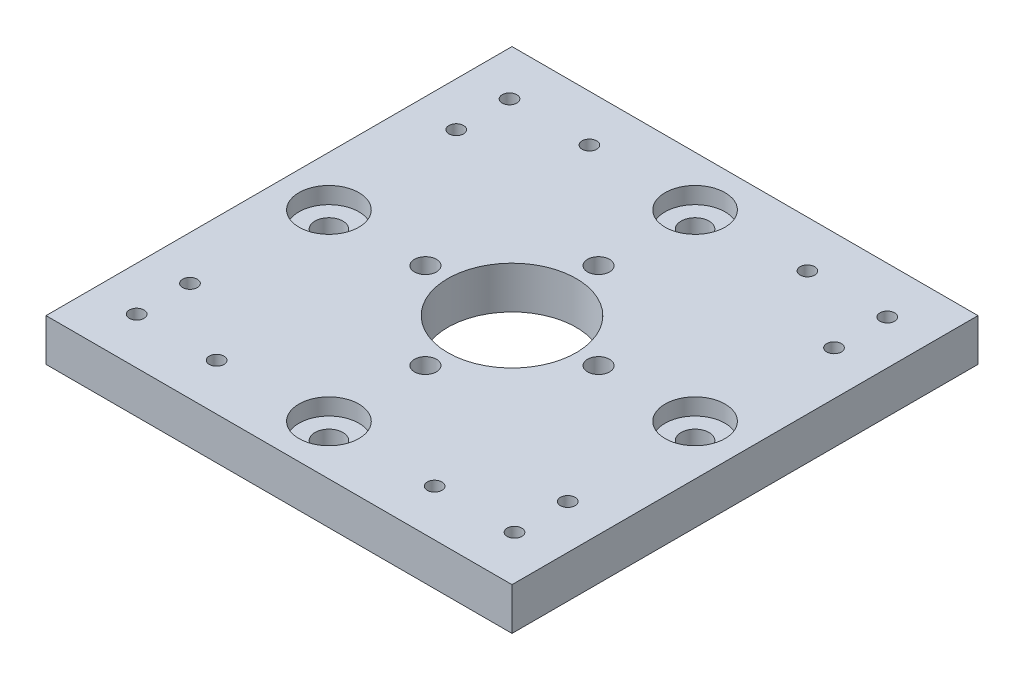
ISO-10303-21;
HEADER;
FILE_DESCRIPTION(('STEP AP214'),'2;1');
FILE_NAME('part.step','',(''),(''),'','','');
FILE_SCHEMA(('AUTOMOTIVE_DESIGN { 1 0 10303 214 1 1 1 1 }'));
ENDSEC;
DATA;
#1=APPLICATION_CONTEXT('core data for automotive mechanical design processes');
#2=APPLICATION_PROTOCOL_DEFINITION('international standard','automotive_design',2000,#1);
#3=PRODUCT_CONTEXT('',#1,'mechanical');
#4=PRODUCT('Part','Part','',(#3));
#5=PRODUCT_RELATED_PRODUCT_CATEGORY('part','',(#4));
#6=PRODUCT_DEFINITION_FORMATION('','',#4);
#7=PRODUCT_DEFINITION_CONTEXT('part definition',#1,'design');
#8=PRODUCT_DEFINITION('design','',#6,#7);
#9=PRODUCT_DEFINITION_SHAPE('','',#8);
#10=(LENGTH_UNIT() NAMED_UNIT(*) SI_UNIT(.MILLI.,.METRE.));
#11=(NAMED_UNIT(*) PLANE_ANGLE_UNIT() SI_UNIT($,.RADIAN.));
#12=(NAMED_UNIT(*) SI_UNIT($,.STERADIAN.) SOLID_ANGLE_UNIT());
#13=UNCERTAINTY_MEASURE_WITH_UNIT(LENGTH_MEASURE(1.E-05),#10,'distance_accuracy_value','');
#14=(GEOMETRIC_REPRESENTATION_CONTEXT(3) GLOBAL_UNCERTAINTY_ASSIGNED_CONTEXT((#13)) GLOBAL_UNIT_ASSIGNED_CONTEXT((#10,
#11,#12)) REPRESENTATION_CONTEXT('',''));
#15=CARTESIAN_POINT('',(0.,0.,0.));
#16=DIRECTION('',(0.,0.,1.));
#17=DIRECTION('',(1.,0.,0.));
#18=AXIS2_PLACEMENT_3D('',#15,#16,#17);
#19=CARTESIAN_POINT('',(1.55309068257925E-12,-0.00100000000000013,27.5));
#20=DIRECTION('',(0.,1.,0.));
#21=DIRECTION('',(0.,0.,1.));
#22=AXIS2_PLACEMENT_3D('',#19,#20,#21);
#23=CYLINDRICAL_SURFACE('',#22,2.1);
#24=CARTESIAN_POINT('',(1.55309068257925E-12,0.,27.5));
#25=DIRECTION('',(0.,1.,0.));
#26=DIRECTION('',(0.,0.,1.));
#27=AXIS2_PLACEMENT_3D('',#24,#25,#26);
#28=CIRCLE('',#27,2.1);
#29=CARTESIAN_POINT('',(1.55309068257925E-12,0.,29.6));
#30=VERTEX_POINT('',#29);
#31=EDGE_CURVE('E141',#30,#30,#28,.F.);
#32=ORIENTED_EDGE('',*,*,#31,.T.);
#33=EDGE_LOOP('',(#32));
#34=FACE_BOUND('',#33,.T.);
#35=CARTESIAN_POINT('',(1.55309068257925E-12,3.85,27.5));
#36=DIRECTION('',(0.,1.,0.));
#37=DIRECTION('',(0.,0.,1.));
#38=AXIS2_PLACEMENT_3D('',#35,#36,#37);
#39=CIRCLE('',#38,2.1);
#40=CARTESIAN_POINT('',(1.55309068257925E-12,3.85,29.6));
#41=VERTEX_POINT('',#40);
#42=EDGE_CURVE('E43',#41,#41,#39,.F.);
#43=ORIENTED_EDGE('',*,*,#42,.F.);
#44=EDGE_LOOP('',(#43));
#45=FACE_BOUND('',#44,.T.);
#46=ADVANCED_FACE('F39',(#34,#45),#23,.F.);
#47=CARTESIAN_POINT('',(27.5000000000008,-0.00100000000000013,-7.76545341289627E-13));
#48=DIRECTION('',(0.,1.,0.));
#49=DIRECTION('',(0.,0.,1.));
#50=AXIS2_PLACEMENT_3D('',#47,#48,#49);
#51=CYLINDRICAL_SURFACE('',#50,2.1);
#52=CARTESIAN_POINT('',(27.5000000000008,0.,-7.76545341289627E-13));
#53=DIRECTION('',(0.,1.,0.));
#54=DIRECTION('',(0.,0.,1.));
#55=AXIS2_PLACEMENT_3D('',#52,#53,#54);
#56=CIRCLE('',#55,2.1);
#57=CARTESIAN_POINT('',(27.5000000000008,0.,2.09999999999922));
#58=VERTEX_POINT('',#57);
#59=EDGE_CURVE('E145',#58,#58,#56,.F.);
#60=ORIENTED_EDGE('',*,*,#59,.T.);
#61=EDGE_LOOP('',(#60));
#62=FACE_BOUND('',#61,.T.);
#63=CARTESIAN_POINT('',(27.5000000000008,3.85,-7.76545341289627E-13));
#64=DIRECTION('',(0.,1.,0.));
#65=DIRECTION('',(0.,0.,1.));
#66=AXIS2_PLACEMENT_3D('',#63,#64,#65);
#67=CIRCLE('',#66,2.1);
#68=CARTESIAN_POINT('',(27.5000000000008,3.85,2.09999999999922));
#69=VERTEX_POINT('',#68);
#70=EDGE_CURVE('E136',#69,#69,#67,.F.);
#71=ORIENTED_EDGE('',*,*,#70,.F.);
#72=EDGE_LOOP('',(#71));
#73=FACE_BOUND('',#72,.T.);
#74=ADVANCED_FACE('F264',(#62,#73),#51,.F.);
#75=CARTESIAN_POINT('',(0.,-0.00100000000000013,-27.5));
#76=DIRECTION('',(0.,1.,0.));
#77=DIRECTION('',(0.,0.,1.));
#78=AXIS2_PLACEMENT_3D('',#75,#76,#77);
#79=CYLINDRICAL_SURFACE('',#78,2.1);
#80=CARTESIAN_POINT('',(0.,0.,-27.5));
#81=DIRECTION('',(0.,1.,0.));
#82=DIRECTION('',(0.,0.,1.));
#83=AXIS2_PLACEMENT_3D('',#80,#81,#82);
#84=CIRCLE('',#83,2.1);
#85=CARTESIAN_POINT('',(0.,0.,-25.4));
#86=VERTEX_POINT('',#85);
#87=EDGE_CURVE('E150',#86,#86,#84,.F.);
#88=ORIENTED_EDGE('',*,*,#87,.T.);
#89=EDGE_LOOP('',(#88));
#90=FACE_BOUND('',#89,.T.);
#91=CARTESIAN_POINT('',(0.,3.85,-27.5));
#92=DIRECTION('',(0.,1.,0.));
#93=DIRECTION('',(0.,0.,1.));
#94=AXIS2_PLACEMENT_3D('',#91,#92,#93);
#95=CIRCLE('',#94,2.1);
#96=CARTESIAN_POINT('',(0.,3.85,-25.4));
#97=VERTEX_POINT('',#96);
#98=EDGE_CURVE('E133',#97,#97,#95,.F.);
#99=ORIENTED_EDGE('',*,*,#98,.F.);
#100=EDGE_LOOP('',(#99));
#101=FACE_BOUND('',#100,.T.);
#102=ADVANCED_FACE('F269',(#90,#101),#79,.F.);
#103=CARTESIAN_POINT('',(-27.4999999999992,-0.00100000000000013,7.79913119987283E-13));
#104=DIRECTION('',(0.,1.,0.));
#105=DIRECTION('',(0.,0.,1.));
#106=AXIS2_PLACEMENT_3D('',#103,#104,#105);
#107=CYLINDRICAL_SURFACE('',#106,2.1);
#108=CARTESIAN_POINT('',(-27.4999999999992,0.,7.79913119987283E-13));
#109=DIRECTION('',(0.,1.,0.));
#110=DIRECTION('',(0.,0.,1.));
#111=AXIS2_PLACEMENT_3D('',#108,#109,#110);
#112=CIRCLE('',#111,2.1);
#113=CARTESIAN_POINT('',(-27.4999999999992,0.,2.10000000000078));
#114=VERTEX_POINT('',#113);
#115=EDGE_CURVE('E158',#114,#114,#112,.F.);
#116=ORIENTED_EDGE('',*,*,#115,.T.);
#117=EDGE_LOOP('',(#116));
#118=FACE_BOUND('',#117,.T.);
#119=CARTESIAN_POINT('',(-27.4999999999992,3.85,7.79913119987283E-13));
#120=DIRECTION('',(0.,1.,0.));
#121=DIRECTION('',(0.,0.,1.));
#122=AXIS2_PLACEMENT_3D('',#119,#120,#121);
#123=CIRCLE('',#122,2.1);
#124=CARTESIAN_POINT('',(-27.4999999999992,3.85,2.10000000000078));
#125=VERTEX_POINT('',#124);
#126=EDGE_CURVE('E130',#125,#125,#123,.F.);
#127=ORIENTED_EDGE('',*,*,#126,.F.);
#128=EDGE_LOOP('',(#127));
#129=FACE_BOUND('',#128,.T.);
#130=ADVANCED_FACE('F342',(#118,#129),#107,.F.);
#131=CARTESIAN_POINT('',(0.,6.35,35.));
#132=DIRECTION('',(0.,0.,-1.));
#133=DIRECTION('',(-1.,0.,0.));
#134=AXIS2_PLACEMENT_3D('',#131,#132,#133);
#135=PLANE('',#134);
#136=DIRECTION('',(1.,0.,0.));
#137=VECTOR('',#136,1.);
#138=CARTESIAN_POINT('',(0.,0.,35.));
#139=LINE('',#138,#137);
#140=CARTESIAN_POINT('',(-35.,0.,35.));
#141=VERTEX_POINT('',#140);
#142=CARTESIAN_POINT('',(35.,0.,35.));
#143=VERTEX_POINT('',#142);
#144=EDGE_CURVE('E119',#141,#143,#139,.T.);
#145=ORIENTED_EDGE('',*,*,#144,.T.);
#146=DIRECTION('',(0.,-1.,0.));
#147=VECTOR('',#146,1.);
#148=CARTESIAN_POINT('',(35.,6.35,35.));
#149=LINE('',#148,#147);
#150=CARTESIAN_POINT('',(35.,6.35,35.));
#151=VERTEX_POINT('',#150);
#152=EDGE_CURVE('E11',#151,#143,#149,.T.);
#153=ORIENTED_EDGE('',*,*,#152,.F.);
#154=DIRECTION('',(1.,0.,0.));
#155=VECTOR('',#154,1.);
#156=CARTESIAN_POINT('',(0.,6.35,35.));
#157=LINE('',#156,#155);
#158=CARTESIAN_POINT('',(-35.,6.35,35.));
#159=VERTEX_POINT('',#158);
#160=EDGE_CURVE('E91',#159,#151,#157,.T.);
#161=ORIENTED_EDGE('',*,*,#160,.F.);
#162=DIRECTION('',(0.,-1.,0.));
#163=VECTOR('',#162,1.);
#164=CARTESIAN_POINT('',(-35.,6.35,35.));
#165=LINE('',#164,#163);
#166=EDGE_CURVE('E58',#159,#141,#165,.T.);
#167=ORIENTED_EDGE('',*,*,#166,.T.);
#168=EDGE_LOOP('',(#145,#153,#161,#167));
#169=FACE_BOUND('',#168,.T.);
#170=ADVANCED_FACE('F340',(#169),#135,.F.);
#171=CARTESIAN_POINT('',(35.,6.35,0.));
#172=DIRECTION('',(-1.,0.,0.));
#173=DIRECTION('',(0.,0.,1.));
#174=AXIS2_PLACEMENT_3D('',#171,#172,#173);
#175=PLANE('',#174);
#176=DIRECTION('',(0.,0.,-1.));
#177=VECTOR('',#176,1.);
#178=CARTESIAN_POINT('',(35.,0.,0.));
#179=LINE('',#178,#177);
#180=CARTESIAN_POINT('',(35.,0.,-35.));
#181=VERTEX_POINT('',#180);
#182=EDGE_CURVE('E96',#143,#181,#179,.T.);
#183=ORIENTED_EDGE('',*,*,#182,.T.);
#184=DIRECTION('',(0.,-1.,0.));
#185=VECTOR('',#184,1.);
#186=CARTESIAN_POINT('',(35.,6.35,-35.));
#187=LINE('',#186,#185);
#188=CARTESIAN_POINT('',(35.,6.35,-35.));
#189=VERTEX_POINT('',#188);
#190=EDGE_CURVE('E49',#189,#181,#187,.T.);
#191=ORIENTED_EDGE('',*,*,#190,.F.);
#192=DIRECTION('',(0.,0.,-1.));
#193=VECTOR('',#192,1.);
#194=CARTESIAN_POINT('',(35.,6.35,0.));
#195=LINE('',#194,#193);
#196=EDGE_CURVE('E83',#151,#189,#195,.T.);
#197=ORIENTED_EDGE('',*,*,#196,.F.);
#198=ORIENTED_EDGE('',*,*,#152,.T.);
#199=EDGE_LOOP('',(#183,#191,#197,#198));
#200=FACE_BOUND('',#199,.T.);
#201=ADVANCED_FACE('F95',(#200),#175,.F.);
#202=CARTESIAN_POINT('',(0.,6.35,-35.));
#203=DIRECTION('',(0.,0.,-1.));
#204=DIRECTION('',(-1.,0.,0.));
#205=AXIS2_PLACEMENT_3D('',#202,#203,#204);
#206=PLANE('',#205);
#207=DIRECTION('',(1.,0.,0.));
#208=VECTOR('',#207,1.);
#209=CARTESIAN_POINT('',(0.,0.,-35.));
#210=LINE('',#209,#208);
#211=CARTESIAN_POINT('',(-35.,0.,-35.));
#212=VERTEX_POINT('',#211);
#213=EDGE_CURVE('E122',#212,#181,#210,.T.);
#214=ORIENTED_EDGE('',*,*,#213,.F.);
#215=DIRECTION('',(0.,-1.,0.));
#216=VECTOR('',#215,1.);
#217=CARTESIAN_POINT('',(-35.,6.35,-35.));
#218=LINE('',#217,#216);
#219=CARTESIAN_POINT('',(-35.,6.35,-35.));
#220=VERTEX_POINT('',#219);
#221=EDGE_CURVE('E72',#220,#212,#218,.T.);
#222=ORIENTED_EDGE('',*,*,#221,.F.);
#223=DIRECTION('',(1.,0.,0.));
#224=VECTOR('',#223,1.);
#225=CARTESIAN_POINT('',(0.,6.35,-35.));
#226=LINE('',#225,#224);
#227=EDGE_CURVE('E90',#220,#189,#226,.T.);
#228=ORIENTED_EDGE('',*,*,#227,.T.);
#229=ORIENTED_EDGE('',*,*,#190,.T.);
#230=EDGE_LOOP('',(#214,#222,#228,#229));
#231=FACE_BOUND('',#230,.T.);
#232=ADVANCED_FACE('F100',(#231),#206,.T.);
#233=CARTESIAN_POINT('',(0.,6.35,13.));
#234=DIRECTION('',(0.,-1.,0.));
#235=DIRECTION('',(0.,0.,-1.));
#236=AXIS2_PLACEMENT_3D('',#233,#234,#235);
#237=CYLINDRICAL_SURFACE('',#236,1.65);
#238=CARTESIAN_POINT('',(0.,6.35,13.));
#239=DIRECTION('',(0.,1.,0.));
#240=DIRECTION('',(0.,0.,1.));
#241=AXIS2_PLACEMENT_3D('',#238,#239,#240);
#242=CIRCLE('',#241,1.65);
#243=CARTESIAN_POINT('',(0.,6.35,14.65));
#244=VERTEX_POINT('',#243);
#245=EDGE_CURVE('E240',#244,#244,#242,.T.);
#246=ORIENTED_EDGE('',*,*,#245,.T.);
#247=EDGE_LOOP('',(#246));
#248=FACE_BOUND('',#247,.T.);
#249=CARTESIAN_POINT('',(0.,0.,13.));
#250=DIRECTION('',(0.,1.,0.));
#251=DIRECTION('',(0.,0.,1.));
#252=AXIS2_PLACEMENT_3D('',#249,#250,#251);
#253=CIRCLE('',#252,1.65);
#254=CARTESIAN_POINT('',(0.,0.,14.65));
#255=VERTEX_POINT('',#254);
#256=EDGE_CURVE('E116',#255,#255,#253,.T.);
#257=ORIENTED_EDGE('',*,*,#256,.F.);
#258=EDGE_LOOP('',(#257));
#259=FACE_BOUND('',#258,.T.);
#260=ADVANCED_FACE('F244',(#248,#259),#237,.F.);
#261=CARTESIAN_POINT('',(13.,6.35,0.));
#262=DIRECTION('',(0.,-1.,0.));
#263=DIRECTION('',(0.,0.,-1.));
#264=AXIS2_PLACEMENT_3D('',#261,#262,#263);
#265=CYLINDRICAL_SURFACE('',#264,1.65);
#266=CARTESIAN_POINT('',(13.,6.35,0.));
#267=DIRECTION('',(0.,1.,0.));
#268=DIRECTION('',(0.,0.,1.));
#269=AXIS2_PLACEMENT_3D('',#266,#267,#268);
#270=CIRCLE('',#269,1.65);
#271=CARTESIAN_POINT('',(13.,6.35,1.65));
#272=VERTEX_POINT('',#271);
#273=EDGE_CURVE('E237',#272,#272,#270,.T.);
#274=ORIENTED_EDGE('',*,*,#273,.T.);
#275=EDGE_LOOP('',(#274));
#276=FACE_BOUND('',#275,.T.);
#277=CARTESIAN_POINT('',(13.,0.,0.));
#278=DIRECTION('',(0.,1.,0.));
#279=DIRECTION('',(0.,0.,1.));
#280=AXIS2_PLACEMENT_3D('',#277,#278,#279);
#281=CIRCLE('',#280,1.65);
#282=CARTESIAN_POINT('',(13.,0.,1.65));
#283=VERTEX_POINT('',#282);
#284=EDGE_CURVE('E113',#283,#283,#281,.T.);
#285=ORIENTED_EDGE('',*,*,#284,.F.);
#286=EDGE_LOOP('',(#285));
#287=FACE_BOUND('',#286,.T.);
#288=ADVANCED_FACE('F355',(#276,#287),#265,.F.);
#289=CARTESIAN_POINT('',(0.,6.35,-13.));
#290=DIRECTION('',(0.,-1.,0.));
#291=DIRECTION('',(0.,0.,-1.));
#292=AXIS2_PLACEMENT_3D('',#289,#290,#291);
#293=CYLINDRICAL_SURFACE('',#292,1.65);
#294=CARTESIAN_POINT('',(0.,6.35,-13.));
#295=DIRECTION('',(0.,1.,0.));
#296=DIRECTION('',(0.,0.,1.));
#297=AXIS2_PLACEMENT_3D('',#294,#295,#296);
#298=CIRCLE('',#297,1.65);
#299=CARTESIAN_POINT('',(0.,6.35,-11.35));
#300=VERTEX_POINT('',#299);
#301=EDGE_CURVE('E234',#300,#300,#298,.T.);
#302=ORIENTED_EDGE('',*,*,#301,.T.);
#303=EDGE_LOOP('',(#302));
#304=FACE_BOUND('',#303,.T.);
#305=CARTESIAN_POINT('',(0.,0.,-13.));
#306=DIRECTION('',(0.,1.,0.));
#307=DIRECTION('',(0.,0.,1.));
#308=AXIS2_PLACEMENT_3D('',#305,#306,#307);
#309=CIRCLE('',#308,1.65);
#310=CARTESIAN_POINT('',(0.,0.,-11.35));
#311=VERTEX_POINT('',#310);
#312=EDGE_CURVE('E109',#311,#311,#309,.T.);
#313=ORIENTED_EDGE('',*,*,#312,.F.);
#314=EDGE_LOOP('',(#313));
#315=FACE_BOUND('',#314,.T.);
#316=ADVANCED_FACE('F357',(#304,#315),#293,.F.);
#317=CARTESIAN_POINT('',(-13.,6.35,0.));
#318=DIRECTION('',(0.,-1.,0.));
#319=DIRECTION('',(0.,0.,-1.));
#320=AXIS2_PLACEMENT_3D('',#317,#318,#319);
#321=CYLINDRICAL_SURFACE('',#320,1.65);
#322=CARTESIAN_POINT('',(-13.,6.35,0.));
#323=DIRECTION('',(0.,1.,0.));
#324=DIRECTION('',(0.,0.,1.));
#325=AXIS2_PLACEMENT_3D('',#322,#323,#324);
#326=CIRCLE('',#325,1.65);
#327=CARTESIAN_POINT('',(-13.,6.35,1.65));
#328=VERTEX_POINT('',#327);
#329=EDGE_CURVE('E127',#328,#328,#326,.T.);
#330=ORIENTED_EDGE('',*,*,#329,.T.);
#331=EDGE_LOOP('',(#330));
#332=FACE_BOUND('',#331,.T.);
#333=CARTESIAN_POINT('',(-13.,0.,0.));
#334=DIRECTION('',(0.,1.,0.));
#335=DIRECTION('',(0.,0.,1.));
#336=AXIS2_PLACEMENT_3D('',#333,#334,#335);
#337=CIRCLE('',#336,1.65);
#338=CARTESIAN_POINT('',(-13.,0.,1.65));
#339=VERTEX_POINT('',#338);
#340=EDGE_CURVE('E106',#339,#339,#337,.T.);
#341=ORIENTED_EDGE('',*,*,#340,.F.);
#342=EDGE_LOOP('',(#341));
#343=FACE_BOUND('',#342,.T.);
#344=ADVANCED_FACE('F41',(#332,#343),#321,.F.);
#345=CARTESIAN_POINT('',(-35.,6.35,0.));
#346=DIRECTION('',(-1.,0.,0.));
#347=DIRECTION('',(0.,0.,1.));
#348=AXIS2_PLACEMENT_3D('',#345,#346,#347);
#349=PLANE('',#348);
#350=DIRECTION('',(0.,0.,-1.));
#351=VECTOR('',#350,1.);
#352=CARTESIAN_POINT('',(-35.,0.,0.));
#353=LINE('',#352,#351);
#354=EDGE_CURVE('E124',#141,#212,#353,.T.);
#355=ORIENTED_EDGE('',*,*,#354,.F.);
#356=ORIENTED_EDGE('',*,*,#166,.F.);
#357=DIRECTION('',(0.,0.,-1.));
#358=VECTOR('',#357,1.);
#359=CARTESIAN_POINT('',(-35.,6.35,0.));
#360=LINE('',#359,#358);
#361=EDGE_CURVE('E101',#159,#220,#360,.T.);
#362=ORIENTED_EDGE('',*,*,#361,.T.);
#363=ORIENTED_EDGE('',*,*,#221,.T.);
#364=EDGE_LOOP('',(#355,#356,#362,#363));
#365=FACE_BOUND('',#364,.T.);
#366=ADVANCED_FACE('F249',(#365),#349,.T.);
#367=CARTESIAN_POINT('',(0.,6.35,0.));
#368=DIRECTION('',(0.,1.,0.));
#369=DIRECTION('',(0.,0.,1.));
#370=AXIS2_PLACEMENT_3D('',#367,#368,#369);
#371=PLANE('',#370);
#372=CARTESIAN_POINT('',(0.,6.35,-27.5));
#373=DIRECTION('',(0.,1.,0.));
#374=DIRECTION('',(0.,0.,1.));
#375=AXIS2_PLACEMENT_3D('',#372,#373,#374);
#376=CIRCLE('',#375,4.5);
#377=CARTESIAN_POINT('',(0.,6.35,-23.));
#378=VERTEX_POINT('',#377);
#379=EDGE_CURVE('E709',#378,#378,#376,.T.);
#380=ORIENTED_EDGE('',*,*,#379,.F.);
#381=EDGE_LOOP('',(#380));
#382=FACE_BOUND('',#381,.T.);
#383=CARTESIAN_POINT('',(27.5000000000008,6.35,-7.76545341289627E-13));
#384=DIRECTION('',(0.,1.,0.));
#385=DIRECTION('',(0.,0.,1.));
#386=AXIS2_PLACEMENT_3D('',#383,#384,#385);
#387=CIRCLE('',#386,4.5);
#388=CARTESIAN_POINT('',(27.5000000000008,6.35,4.49999999999923));
#389=VERTEX_POINT('',#388);
#390=EDGE_CURVE('E616',#389,#389,#387,.T.);
#391=ORIENTED_EDGE('',*,*,#390,.F.);
#392=EDGE_LOOP('',(#391));
#393=FACE_BOUND('',#392,.T.);
#394=CARTESIAN_POINT('',(1.55309068257925E-12,6.35,27.5));
#395=DIRECTION('',(0.,1.,0.));
#396=DIRECTION('',(0.,0.,1.));
#397=AXIS2_PLACEMENT_3D('',#394,#395,#396);
#398=CIRCLE('',#397,4.5);
#399=CARTESIAN_POINT('',(1.55309068257925E-12,6.35,32.));
#400=VERTEX_POINT('',#399);
#401=EDGE_CURVE('E611',#400,#400,#398,.T.);
#402=ORIENTED_EDGE('',*,*,#401,.F.);
#403=EDGE_LOOP('',(#402));
#404=FACE_BOUND('',#403,.T.);
#405=CARTESIAN_POINT('',(-27.4999999999992,6.35,7.79913119987283E-13));
#406=DIRECTION('',(0.,1.,0.));
#407=DIRECTION('',(0.,0.,1.));
#408=AXIS2_PLACEMENT_3D('',#405,#406,#407);
#409=CIRCLE('',#408,4.5);
#410=CARTESIAN_POINT('',(-27.4999999999992,6.35,4.50000000000078));
#411=VERTEX_POINT('',#410);
#412=EDGE_CURVE('E618',#411,#411,#409,.T.);
#413=ORIENTED_EDGE('',*,*,#412,.F.);
#414=EDGE_LOOP('',(#413));
#415=FACE_BOUND('',#414,.T.);
#416=CARTESIAN_POINT('',(0.,6.35,0.));
#417=DIRECTION('',(0.,1.,0.));
#418=DIRECTION('',(0.,0.,1.));
#419=AXIS2_PLACEMENT_3D('',#416,#417,#418);
#420=CIRCLE('',#419,9.65);
#421=CARTESIAN_POINT('',(0.,6.35,9.65));
#422=VERTEX_POINT('',#421);
#423=EDGE_CURVE('E154',#422,#422,#420,.T.);
#424=ORIENTED_EDGE('',*,*,#423,.F.);
#425=EDGE_LOOP('',(#424));
#426=FACE_BOUND('',#425,.T.);
#427=CARTESIAN_POINT('',(16.375,6.35,28.));
#428=DIRECTION('',(0.,1.,0.));
#429=DIRECTION('',(0.,0.,-1.));
#430=AXIS2_PLACEMENT_3D('',#427,#428,#429);
#431=CIRCLE('',#430,1.1);
#432=CARTESIAN_POINT('',(16.375,6.35,26.9));
#433=VERTEX_POINT('',#432);
#434=EDGE_CURVE('E197',#433,#433,#431,.T.);
#435=ORIENTED_EDGE('',*,*,#434,.F.);
#436=EDGE_LOOP('',(#435));
#437=FACE_BOUND('',#436,.T.);
#438=CARTESIAN_POINT('',(28.375,6.35,28.));
#439=DIRECTION('',(0.,1.,0.));
#440=DIRECTION('',(0.,0.,-1.));
#441=AXIS2_PLACEMENT_3D('',#438,#439,#440);
#442=CIRCLE('',#441,1.1);
#443=CARTESIAN_POINT('',(28.375,6.35,26.9));
#444=VERTEX_POINT('',#443);
#445=EDGE_CURVE('E191',#444,#444,#442,.T.);
#446=ORIENTED_EDGE('',*,*,#445,.F.);
#447=EDGE_LOOP('',(#446));
#448=FACE_BOUND('',#447,.T.);
#449=CARTESIAN_POINT('',(28.375,6.35,20.));
#450=DIRECTION('',(0.,1.,0.));
#451=DIRECTION('',(0.,0.,-1.));
#452=AXIS2_PLACEMENT_3D('',#449,#450,#451);
#453=CIRCLE('',#452,1.1);
#454=CARTESIAN_POINT('',(28.375,6.35,18.9));
#455=VERTEX_POINT('',#454);
#456=EDGE_CURVE('E184',#455,#455,#453,.T.);
#457=ORIENTED_EDGE('',*,*,#456,.F.);
#458=EDGE_LOOP('',(#457));
#459=FACE_BOUND('',#458,.T.);
#460=CARTESIAN_POINT('',(-16.375,6.35,-28.));
#461=DIRECTION('',(0.,1.,0.));
#462=DIRECTION('',(0.,0.,-1.));
#463=AXIS2_PLACEMENT_3D('',#460,#461,#462);
#464=CIRCLE('',#463,1.1);
#465=CARTESIAN_POINT('',(-16.375,6.35,-29.1));
#466=VERTEX_POINT('',#465);
#467=EDGE_CURVE('E183',#466,#466,#464,.T.);
#468=ORIENTED_EDGE('',*,*,#467,.F.);
#469=EDGE_LOOP('',(#468));
#470=FACE_BOUND('',#469,.T.);
#471=CARTESIAN_POINT('',(-28.375,6.35,-28.));
#472=DIRECTION('',(0.,1.,0.));
#473=DIRECTION('',(0.,0.,-1.));
#474=AXIS2_PLACEMENT_3D('',#471,#472,#473);
#475=CIRCLE('',#474,1.1);
#476=CARTESIAN_POINT('',(-28.375,6.35,-29.1));
#477=VERTEX_POINT('',#476);
#478=EDGE_CURVE('E221',#477,#477,#475,.T.);
#479=ORIENTED_EDGE('',*,*,#478,.F.);
#480=EDGE_LOOP('',(#479));
#481=FACE_BOUND('',#480,.T.);
#482=CARTESIAN_POINT('',(-28.375,6.35,-20.));
#483=DIRECTION('',(0.,1.,0.));
#484=DIRECTION('',(0.,0.,-1.));
#485=AXIS2_PLACEMENT_3D('',#482,#483,#484);
#486=CIRCLE('',#485,1.1);
#487=CARTESIAN_POINT('',(-28.375,6.35,-21.1));
#488=VERTEX_POINT('',#487);
#489=EDGE_CURVE('E215',#488,#488,#486,.T.);
#490=ORIENTED_EDGE('',*,*,#489,.F.);
#491=EDGE_LOOP('',(#490));
#492=FACE_BOUND('',#491,.T.);
#493=CARTESIAN_POINT('',(28.375,6.35,-20.));
#494=DIRECTION('',(0.,1.,0.));
#495=DIRECTION('',(0.,0.,1.));
#496=AXIS2_PLACEMENT_3D('',#493,#494,#495);
#497=CIRCLE('',#496,1.1);
#498=CARTESIAN_POINT('',(28.375,6.35,-18.9));
#499=VERTEX_POINT('',#498);
#500=EDGE_CURVE('E208',#499,#499,#497,.T.);
#501=ORIENTED_EDGE('',*,*,#500,.F.);
#502=EDGE_LOOP('',(#501));
#503=FACE_BOUND('',#502,.T.);
#504=CARTESIAN_POINT('',(28.375,6.35,-28.));
#505=DIRECTION('',(0.,1.,0.));
#506=DIRECTION('',(0.,0.,1.));
#507=AXIS2_PLACEMENT_3D('',#504,#505,#506);
#508=CIRCLE('',#507,1.1);
#509=CARTESIAN_POINT('',(28.375,6.35,-26.9));
#510=VERTEX_POINT('',#509);
#511=EDGE_CURVE('E207',#510,#510,#508,.T.);
#512=ORIENTED_EDGE('',*,*,#511,.F.);
#513=EDGE_LOOP('',(#512));
#514=FACE_BOUND('',#513,.T.);
#515=CARTESIAN_POINT('',(-28.375,6.35,28.));
#516=DIRECTION('',(0.,1.,0.));
#517=DIRECTION('',(0.,0.,1.));
#518=AXIS2_PLACEMENT_3D('',#515,#516,#517);
#519=CIRCLE('',#518,1.1);
#520=CARTESIAN_POINT('',(-28.375,6.35,29.1));
#521=VERTEX_POINT('',#520);
#522=EDGE_CURVE('E164',#521,#521,#519,.T.);
#523=ORIENTED_EDGE('',*,*,#522,.F.);
#524=EDGE_LOOP('',(#523));
#525=FACE_BOUND('',#524,.T.);
#526=CARTESIAN_POINT('',(-28.375,6.35,20.));
#527=DIRECTION('',(0.,1.,0.));
#528=DIRECTION('',(0.,0.,1.));
#529=AXIS2_PLACEMENT_3D('',#526,#527,#528);
#530=CIRCLE('',#529,1.1);
#531=CARTESIAN_POINT('',(-28.375,6.35,21.1));
#532=VERTEX_POINT('',#531);
#533=EDGE_CURVE('E172',#532,#532,#530,.T.);
#534=ORIENTED_EDGE('',*,*,#533,.F.);
#535=EDGE_LOOP('',(#534));
#536=FACE_BOUND('',#535,.T.);
#537=CARTESIAN_POINT('',(-16.375,6.35,28.));
#538=DIRECTION('',(0.,1.,0.));
#539=DIRECTION('',(0.,0.,1.));
#540=AXIS2_PLACEMENT_3D('',#537,#538,#539);
#541=CIRCLE('',#540,1.1);
#542=CARTESIAN_POINT('',(-16.375,6.35,29.1));
#543=VERTEX_POINT('',#542);
#544=EDGE_CURVE('E171',#543,#543,#541,.T.);
#545=ORIENTED_EDGE('',*,*,#544,.F.);
#546=EDGE_LOOP('',(#545));
#547=FACE_BOUND('',#546,.T.);
#548=CARTESIAN_POINT('',(16.375,6.35,-28.));
#549=DIRECTION('',(0.,1.,0.));
#550=DIRECTION('',(0.,0.,1.));
#551=AXIS2_PLACEMENT_3D('',#548,#549,#550);
#552=CIRCLE('',#551,1.1);
#553=CARTESIAN_POINT('',(16.375,6.35,-26.9));
#554=VERTEX_POINT('',#553);
#555=EDGE_CURVE('E211',#554,#554,#552,.T.);
#556=ORIENTED_EDGE('',*,*,#555,.F.);
#557=EDGE_LOOP('',(#556));
#558=FACE_BOUND('',#557,.T.);
#559=ORIENTED_EDGE('',*,*,#329,.F.);
#560=EDGE_LOOP('',(#559));
#561=FACE_BOUND('',#560,.T.);
#562=ORIENTED_EDGE('',*,*,#301,.F.);
#563=EDGE_LOOP('',(#562));
#564=FACE_BOUND('',#563,.T.);
#565=ORIENTED_EDGE('',*,*,#273,.F.);
#566=EDGE_LOOP('',(#565));
#567=FACE_BOUND('',#566,.T.);
#568=ORIENTED_EDGE('',*,*,#245,.F.);
#569=EDGE_LOOP('',(#568));
#570=FACE_BOUND('',#569,.T.);
#571=ORIENTED_EDGE('',*,*,#160,.T.);
#572=ORIENTED_EDGE('',*,*,#196,.T.);
#573=ORIENTED_EDGE('',*,*,#227,.F.);
#574=ORIENTED_EDGE('',*,*,#361,.F.);
#575=EDGE_LOOP('',(#571,#572,#573,#574));
#576=FACE_BOUND('',#575,.T.);
#577=ADVANCED_FACE('F87',(#382,#393,#404,#415,#426,#437,#448,#459,#470,#481,#492,#503,#514,#525,
#536,#547,#558,#561,#564,#567,#570,#576),#371,.T.);
#578=CARTESIAN_POINT('',(0.,0.,0.));
#579=DIRECTION('',(0.,1.,0.));
#580=DIRECTION('',(0.,0.,1.));
#581=AXIS2_PLACEMENT_3D('',#578,#579,#580);
#582=PLANE('',#581);
#583=ORIENTED_EDGE('',*,*,#115,.F.);
#584=EDGE_LOOP('',(#583));
#585=FACE_BOUND('',#584,.T.);
#586=ORIENTED_EDGE('',*,*,#87,.F.);
#587=EDGE_LOOP('',(#586));
#588=FACE_BOUND('',#587,.T.);
#589=ORIENTED_EDGE('',*,*,#59,.F.);
#590=EDGE_LOOP('',(#589));
#591=FACE_BOUND('',#590,.T.);
#592=ORIENTED_EDGE('',*,*,#31,.F.);
#593=EDGE_LOOP('',(#592));
#594=FACE_BOUND('',#593,.T.);
#595=CARTESIAN_POINT('',(0.,0.,0.));
#596=DIRECTION('',(0.,1.,0.));
#597=DIRECTION('',(0.,0.,1.));
#598=AXIS2_PLACEMENT_3D('',#595,#596,#597);
#599=CIRCLE('',#598,9.65);
#600=CARTESIAN_POINT('',(0.,0.,9.65));
#601=VERTEX_POINT('',#600);
#602=EDGE_CURVE('E157',#601,#601,#599,.F.);
#603=ORIENTED_EDGE('',*,*,#602,.F.);
#604=EDGE_LOOP('',(#603));
#605=FACE_BOUND('',#604,.T.);
#606=CARTESIAN_POINT('',(16.375,0.,28.));
#607=DIRECTION('',(0.,1.,0.));
#608=DIRECTION('',(0.,0.,1.));
#609=AXIS2_PLACEMENT_3D('',#606,#607,#608);
#610=CIRCLE('',#609,1.1);
#611=CARTESIAN_POINT('',(16.375,0.,29.1));
#612=VERTEX_POINT('',#611);
#613=EDGE_CURVE('E175',#612,#612,#610,.F.);
#614=ORIENTED_EDGE('',*,*,#613,.F.);
#615=EDGE_LOOP('',(#614));
#616=FACE_BOUND('',#615,.T.);
#617=CARTESIAN_POINT('',(28.375,0.,28.));
#618=DIRECTION('',(0.,1.,0.));
#619=DIRECTION('',(0.,0.,1.));
#620=AXIS2_PLACEMENT_3D('',#617,#618,#619);
#621=CIRCLE('',#620,1.1);
#622=CARTESIAN_POINT('',(28.375,0.,29.1));
#623=VERTEX_POINT('',#622);
#624=EDGE_CURVE('E194',#623,#623,#621,.F.);
#625=ORIENTED_EDGE('',*,*,#624,.F.);
#626=EDGE_LOOP('',(#625));
#627=FACE_BOUND('',#626,.T.);
#628=CARTESIAN_POINT('',(28.375,0.,20.));
#629=DIRECTION('',(0.,1.,0.));
#630=DIRECTION('',(0.,0.,1.));
#631=AXIS2_PLACEMENT_3D('',#628,#629,#630);
#632=CIRCLE('',#631,1.1);
#633=CARTESIAN_POINT('',(28.375,0.,21.1));
#634=VERTEX_POINT('',#633);
#635=EDGE_CURVE('E188',#634,#634,#632,.F.);
#636=ORIENTED_EDGE('',*,*,#635,.F.);
#637=EDGE_LOOP('',(#636));
#638=FACE_BOUND('',#637,.T.);
#639=CARTESIAN_POINT('',(-16.375,0.,-28.));
#640=DIRECTION('',(0.,1.,0.));
#641=DIRECTION('',(0.,0.,1.));
#642=AXIS2_PLACEMENT_3D('',#639,#640,#641);
#643=CIRCLE('',#642,1.1);
#644=CARTESIAN_POINT('',(-16.375,0.,-26.9));
#645=VERTEX_POINT('',#644);
#646=EDGE_CURVE('E180',#645,#645,#643,.F.);
#647=ORIENTED_EDGE('',*,*,#646,.F.);
#648=EDGE_LOOP('',(#647));
#649=FACE_BOUND('',#648,.T.);
#650=CARTESIAN_POINT('',(-28.375,0.,-28.));
#651=DIRECTION('',(0.,1.,0.));
#652=DIRECTION('',(0.,0.,1.));
#653=AXIS2_PLACEMENT_3D('',#650,#651,#652);
#654=CIRCLE('',#653,1.1);
#655=CARTESIAN_POINT('',(-28.375,0.,-26.9));
#656=VERTEX_POINT('',#655);
#657=EDGE_CURVE('E187',#656,#656,#654,.F.);
#658=ORIENTED_EDGE('',*,*,#657,.F.);
#659=EDGE_LOOP('',(#658));
#660=FACE_BOUND('',#659,.T.);
#661=CARTESIAN_POINT('',(-28.375,0.,-20.));
#662=DIRECTION('',(0.,1.,0.));
#663=DIRECTION('',(0.,0.,1.));
#664=AXIS2_PLACEMENT_3D('',#661,#662,#663);
#665=CIRCLE('',#664,1.1);
#666=CARTESIAN_POINT('',(-28.375,0.,-18.9));
#667=VERTEX_POINT('',#666);
#668=EDGE_CURVE('E218',#667,#667,#665,.F.);
#669=ORIENTED_EDGE('',*,*,#668,.F.);
#670=EDGE_LOOP('',(#669));
#671=FACE_BOUND('',#670,.T.);
#672=CARTESIAN_POINT('',(28.375,0.,-20.));
#673=DIRECTION('',(0.,1.,0.));
#674=DIRECTION('',(0.,0.,1.));
#675=AXIS2_PLACEMENT_3D('',#672,#673,#674);
#676=CIRCLE('',#675,1.1);
#677=CARTESIAN_POINT('',(28.375,0.,-18.9));
#678=VERTEX_POINT('',#677);
#679=EDGE_CURVE('E212',#678,#678,#676,.F.);
#680=ORIENTED_EDGE('',*,*,#679,.F.);
#681=EDGE_LOOP('',(#680));
#682=FACE_BOUND('',#681,.T.);
#683=CARTESIAN_POINT('',(28.375,0.,-28.));
#684=DIRECTION('',(0.,1.,0.));
#685=DIRECTION('',(0.,0.,1.));
#686=AXIS2_PLACEMENT_3D('',#683,#684,#685);
#687=CIRCLE('',#686,1.1);
#688=CARTESIAN_POINT('',(28.375,0.,-26.9));
#689=VERTEX_POINT('',#688);
#690=EDGE_CURVE('E204',#689,#689,#687,.F.);
#691=ORIENTED_EDGE('',*,*,#690,.F.);
#692=EDGE_LOOP('',(#691));
#693=FACE_BOUND('',#692,.T.);
#694=CARTESIAN_POINT('',(-28.375,0.,28.));
#695=DIRECTION('',(0.,1.,0.));
#696=DIRECTION('',(0.,0.,1.));
#697=AXIS2_PLACEMENT_3D('',#694,#695,#696);
#698=CIRCLE('',#697,1.1);
#699=CARTESIAN_POINT('',(-28.375,0.,29.1));
#700=VERTEX_POINT('',#699);
#701=EDGE_CURVE('E161',#700,#700,#698,.F.);
#702=ORIENTED_EDGE('',*,*,#701,.F.);
#703=EDGE_LOOP('',(#702));
#704=FACE_BOUND('',#703,.T.);
#705=CARTESIAN_POINT('',(-28.375,0.,20.));
#706=DIRECTION('',(0.,1.,0.));
#707=DIRECTION('',(0.,0.,1.));
#708=AXIS2_PLACEMENT_3D('',#705,#706,#707);
#709=CIRCLE('',#708,1.1);
#710=CARTESIAN_POINT('',(-28.375,0.,21.1));
#711=VERTEX_POINT('',#710);
#712=EDGE_CURVE('E167',#711,#711,#709,.F.);
#713=ORIENTED_EDGE('',*,*,#712,.F.);
#714=EDGE_LOOP('',(#713));
#715=FACE_BOUND('',#714,.T.);
#716=CARTESIAN_POINT('',(-16.375,0.,28.));
#717=DIRECTION('',(0.,1.,0.));
#718=DIRECTION('',(0.,0.,1.));
#719=AXIS2_PLACEMENT_3D('',#716,#717,#718);
#720=CIRCLE('',#719,1.1);
#721=CARTESIAN_POINT('',(-16.375,0.,29.1));
#722=VERTEX_POINT('',#721);
#723=EDGE_CURVE('E168',#722,#722,#720,.F.);
#724=ORIENTED_EDGE('',*,*,#723,.F.);
#725=EDGE_LOOP('',(#724));
#726=FACE_BOUND('',#725,.T.);
#727=CARTESIAN_POINT('',(16.375,0.,-28.));
#728=DIRECTION('',(0.,1.,0.));
#729=DIRECTION('',(0.,0.,1.));
#730=AXIS2_PLACEMENT_3D('',#727,#728,#729);
#731=CIRCLE('',#730,1.1);
#732=CARTESIAN_POINT('',(16.375,0.,-26.9));
#733=VERTEX_POINT('',#732);
#734=EDGE_CURVE('E110',#733,#733,#731,.F.);
#735=ORIENTED_EDGE('',*,*,#734,.F.);
#736=EDGE_LOOP('',(#735));
#737=FACE_BOUND('',#736,.T.);
#738=ORIENTED_EDGE('',*,*,#340,.T.);
#739=EDGE_LOOP('',(#738));
#740=FACE_BOUND('',#739,.T.);
#741=ORIENTED_EDGE('',*,*,#312,.T.);
#742=EDGE_LOOP('',(#741));
#743=FACE_BOUND('',#742,.T.);
#744=ORIENTED_EDGE('',*,*,#284,.T.);
#745=EDGE_LOOP('',(#744));
#746=FACE_BOUND('',#745,.T.);
#747=ORIENTED_EDGE('',*,*,#256,.T.);
#748=EDGE_LOOP('',(#747));
#749=FACE_BOUND('',#748,.T.);
#750=ORIENTED_EDGE('',*,*,#144,.F.);
#751=ORIENTED_EDGE('',*,*,#354,.T.);
#752=ORIENTED_EDGE('',*,*,#213,.T.);
#753=ORIENTED_EDGE('',*,*,#182,.F.);
#754=EDGE_LOOP('',(#750,#751,#752,#753));
#755=FACE_BOUND('',#754,.T.);
#756=ADVANCED_FACE('F248',(#585,#588,#591,#594,#605,#616,#627,#638,#649,#660,#671,#682,#693,
#704,#715,#726,#737,#740,#743,#746,#749,#755),#582,.F.);
#757=CARTESIAN_POINT('',(16.375,-0.00100000000000013,-28.));
#758=DIRECTION('',(0.,1.,0.));
#759=DIRECTION('',(0.,0.,1.));
#760=AXIS2_PLACEMENT_3D('',#757,#758,#759);
#761=CYLINDRICAL_SURFACE('',#760,1.1);
#762=ORIENTED_EDGE('',*,*,#555,.T.);
#763=EDGE_LOOP('',(#762));
#764=FACE_BOUND('',#763,.T.);
#765=ORIENTED_EDGE('',*,*,#734,.T.);
#766=EDGE_LOOP('',(#765));
#767=FACE_BOUND('',#766,.T.);
#768=ADVANCED_FACE('F256',(#764,#767),#761,.F.);
#769=CARTESIAN_POINT('',(-16.375,-0.00100000000000013,28.));
#770=DIRECTION('',(0.,1.,0.));
#771=DIRECTION('',(0.,0.,1.));
#772=AXIS2_PLACEMENT_3D('',#769,#770,#771);
#773=CYLINDRICAL_SURFACE('',#772,1.1);
#774=ORIENTED_EDGE('',*,*,#544,.T.);
#775=EDGE_LOOP('',(#774));
#776=FACE_BOUND('',#775,.T.);
#777=ORIENTED_EDGE('',*,*,#723,.T.);
#778=EDGE_LOOP('',(#777));
#779=FACE_BOUND('',#778,.T.);
#780=ADVANCED_FACE('F287',(#776,#779),#773,.F.);
#781=CARTESIAN_POINT('',(-28.375,-0.00100000000000013,20.));
#782=DIRECTION('',(0.,1.,0.));
#783=DIRECTION('',(0.,0.,1.));
#784=AXIS2_PLACEMENT_3D('',#781,#782,#783);
#785=CYLINDRICAL_SURFACE('',#784,1.1);
#786=ORIENTED_EDGE('',*,*,#533,.T.);
#787=EDGE_LOOP('',(#786));
#788=FACE_BOUND('',#787,.T.);
#789=ORIENTED_EDGE('',*,*,#712,.T.);
#790=EDGE_LOOP('',(#789));
#791=FACE_BOUND('',#790,.T.);
#792=ADVANCED_FACE('F285',(#788,#791),#785,.F.);
#793=CARTESIAN_POINT('',(-28.375,-0.00100000000000013,28.));
#794=DIRECTION('',(0.,1.,0.));
#795=DIRECTION('',(0.,0.,1.));
#796=AXIS2_PLACEMENT_3D('',#793,#794,#795);
#797=CYLINDRICAL_SURFACE('',#796,1.1);
#798=ORIENTED_EDGE('',*,*,#522,.T.);
#799=EDGE_LOOP('',(#798));
#800=FACE_BOUND('',#799,.T.);
#801=ORIENTED_EDGE('',*,*,#701,.T.);
#802=EDGE_LOOP('',(#801));
#803=FACE_BOUND('',#802,.T.);
#804=ADVANCED_FACE('F281',(#800,#803),#797,.F.);
#805=CARTESIAN_POINT('',(28.375,-0.00100000000000013,-28.));
#806=DIRECTION('',(0.,1.,0.));
#807=DIRECTION('',(0.,0.,1.));
#808=AXIS2_PLACEMENT_3D('',#805,#806,#807);
#809=CYLINDRICAL_SURFACE('',#808,1.1);
#810=ORIENTED_EDGE('',*,*,#511,.T.);
#811=EDGE_LOOP('',(#810));
#812=FACE_BOUND('',#811,.T.);
#813=ORIENTED_EDGE('',*,*,#690,.T.);
#814=EDGE_LOOP('',(#813));
#815=FACE_BOUND('',#814,.T.);
#816=ADVANCED_FACE('F284',(#812,#815),#809,.F.);
#817=CARTESIAN_POINT('',(28.375,-0.00100000000000013,-20.));
#818=DIRECTION('',(0.,1.,0.));
#819=DIRECTION('',(0.,0.,1.));
#820=AXIS2_PLACEMENT_3D('',#817,#818,#819);
#821=CYLINDRICAL_SURFACE('',#820,1.1);
#822=ORIENTED_EDGE('',*,*,#500,.T.);
#823=EDGE_LOOP('',(#822));
#824=FACE_BOUND('',#823,.T.);
#825=ORIENTED_EDGE('',*,*,#679,.T.);
#826=EDGE_LOOP('',(#825));
#827=FACE_BOUND('',#826,.T.);
#828=ADVANCED_FACE('F312',(#824,#827),#821,.F.);
#829=CARTESIAN_POINT('',(-28.375,-0.00100000000000013,-20.));
#830=DIRECTION('',(0.,1.,0.));
#831=DIRECTION('',(0.,0.,1.));
#832=AXIS2_PLACEMENT_3D('',#829,#830,#831);
#833=CYLINDRICAL_SURFACE('',#832,1.1);
#834=ORIENTED_EDGE('',*,*,#489,.T.);
#835=EDGE_LOOP('',(#834));
#836=FACE_BOUND('',#835,.T.);
#837=ORIENTED_EDGE('',*,*,#668,.T.);
#838=EDGE_LOOP('',(#837));
#839=FACE_BOUND('',#838,.T.);
#840=ADVANCED_FACE('F316',(#836,#839),#833,.F.);
#841=CARTESIAN_POINT('',(-28.375,-0.00100000000000013,-28.));
#842=DIRECTION('',(0.,1.,0.));
#843=DIRECTION('',(0.,0.,1.));
#844=AXIS2_PLACEMENT_3D('',#841,#842,#843);
#845=CYLINDRICAL_SURFACE('',#844,1.1);
#846=ORIENTED_EDGE('',*,*,#478,.T.);
#847=EDGE_LOOP('',(#846));
#848=FACE_BOUND('',#847,.T.);
#849=ORIENTED_EDGE('',*,*,#657,.T.);
#850=EDGE_LOOP('',(#849));
#851=FACE_BOUND('',#850,.T.);
#852=ADVANCED_FACE('F298',(#848,#851),#845,.F.);
#853=CARTESIAN_POINT('',(-16.375,-0.00100000000000013,-28.));
#854=DIRECTION('',(0.,1.,0.));
#855=DIRECTION('',(0.,0.,1.));
#856=AXIS2_PLACEMENT_3D('',#853,#854,#855);
#857=CYLINDRICAL_SURFACE('',#856,1.1);
#858=ORIENTED_EDGE('',*,*,#467,.T.);
#859=EDGE_LOOP('',(#858));
#860=FACE_BOUND('',#859,.T.);
#861=ORIENTED_EDGE('',*,*,#646,.T.);
#862=EDGE_LOOP('',(#861));
#863=FACE_BOUND('',#862,.T.);
#864=ADVANCED_FACE('F294',(#860,#863),#857,.F.);
#865=CARTESIAN_POINT('',(28.375,-0.00100000000000013,20.));
#866=DIRECTION('',(0.,1.,0.));
#867=DIRECTION('',(0.,0.,1.));
#868=AXIS2_PLACEMENT_3D('',#865,#866,#867);
#869=CYLINDRICAL_SURFACE('',#868,1.1);
#870=ORIENTED_EDGE('',*,*,#456,.T.);
#871=EDGE_LOOP('',(#870));
#872=FACE_BOUND('',#871,.T.);
#873=ORIENTED_EDGE('',*,*,#635,.T.);
#874=EDGE_LOOP('',(#873));
#875=FACE_BOUND('',#874,.T.);
#876=ADVANCED_FACE('F297',(#872,#875),#869,.F.);
#877=CARTESIAN_POINT('',(28.375,-0.00100000000000013,28.));
#878=DIRECTION('',(0.,1.,0.));
#879=DIRECTION('',(0.,0.,1.));
#880=AXIS2_PLACEMENT_3D('',#877,#878,#879);
#881=CYLINDRICAL_SURFACE('',#880,1.1);
#882=ORIENTED_EDGE('',*,*,#445,.T.);
#883=EDGE_LOOP('',(#882));
#884=FACE_BOUND('',#883,.T.);
#885=ORIENTED_EDGE('',*,*,#624,.T.);
#886=EDGE_LOOP('',(#885));
#887=FACE_BOUND('',#886,.T.);
#888=ADVANCED_FACE('F302',(#884,#887),#881,.F.);
#889=CARTESIAN_POINT('',(16.375,-0.00100000000000013,28.));
#890=DIRECTION('',(0.,1.,0.));
#891=DIRECTION('',(0.,0.,1.));
#892=AXIS2_PLACEMENT_3D('',#889,#890,#891);
#893=CYLINDRICAL_SURFACE('',#892,1.1);
#894=ORIENTED_EDGE('',*,*,#434,.T.);
#895=EDGE_LOOP('',(#894));
#896=FACE_BOUND('',#895,.T.);
#897=ORIENTED_EDGE('',*,*,#613,.T.);
#898=EDGE_LOOP('',(#897));
#899=FACE_BOUND('',#898,.T.);
#900=ADVANCED_FACE('F279',(#896,#899),#893,.F.);
#901=CARTESIAN_POINT('',(0.,-0.00100000000000013,0.));
#902=DIRECTION('',(0.,1.,0.));
#903=DIRECTION('',(0.,0.,1.));
#904=AXIS2_PLACEMENT_3D('',#901,#902,#903);
#905=CYLINDRICAL_SURFACE('',#904,9.65);
#906=ORIENTED_EDGE('',*,*,#423,.T.);
#907=EDGE_LOOP('',(#906));
#908=FACE_BOUND('',#907,.T.);
#909=ORIENTED_EDGE('',*,*,#602,.T.);
#910=EDGE_LOOP('',(#909));
#911=FACE_BOUND('',#910,.T.);
#912=ADVANCED_FACE('F275',(#908,#911),#905,.F.);
#913=CARTESIAN_POINT('',(-27.4999999999992,3.85,7.79913119987283E-13));
#914=DIRECTION('',(0.,1.,0.));
#915=DIRECTION('',(0.,0.,1.));
#916=AXIS2_PLACEMENT_3D('',#913,#914,#915);
#917=PLANE('',#916);
#918=CARTESIAN_POINT('',(-27.4999999999992,3.85,7.79913119987283E-13));
#919=DIRECTION('',(0.,1.,0.));
#920=DIRECTION('',(0.,0.,1.));
#921=AXIS2_PLACEMENT_3D('',#918,#919,#920);
#922=CIRCLE('',#921,4.5);
#923=CARTESIAN_POINT('',(-27.4999999999992,3.85,4.50000000000078));
#924=VERTEX_POINT('',#923);
#925=EDGE_CURVE('E624',#924,#924,#922,.T.);
#926=ORIENTED_EDGE('',*,*,#925,.T.);
#927=EDGE_LOOP('',(#926));
#928=FACE_BOUND('',#927,.T.);
#929=ORIENTED_EDGE('',*,*,#126,.T.);
#930=EDGE_LOOP('',(#929));
#931=FACE_BOUND('',#930,.T.);
#932=ADVANCED_FACE('F278',(#928,#931),#917,.T.);
#933=CARTESIAN_POINT('',(-27.4999999999992,3.85,7.79913119987283E-13));
#934=DIRECTION('',(0.,1.,0.));
#935=DIRECTION('',(0.,0.,1.));
#936=AXIS2_PLACEMENT_3D('',#933,#934,#935);
#937=CYLINDRICAL_SURFACE('',#936,4.5);
#938=ORIENTED_EDGE('',*,*,#925,.F.);
#939=EDGE_LOOP('',(#938));
#940=FACE_BOUND('',#939,.T.);
#941=ORIENTED_EDGE('',*,*,#412,.T.);
#942=EDGE_LOOP('',(#941));
#943=FACE_BOUND('',#942,.T.);
#944=ADVANCED_FACE('F516',(#940,#943),#937,.F.);
#945=CARTESIAN_POINT('',(0.,3.85,-27.5));
#946=DIRECTION('',(0.,1.,0.));
#947=DIRECTION('',(0.,0.,1.));
#948=AXIS2_PLACEMENT_3D('',#945,#946,#947);
#949=PLANE('',#948);
#950=CARTESIAN_POINT('',(0.,3.85,-27.5));
#951=DIRECTION('',(0.,1.,0.));
#952=DIRECTION('',(0.,0.,1.));
#953=AXIS2_PLACEMENT_3D('',#950,#951,#952);
#954=CIRCLE('',#953,4.5);
#955=CARTESIAN_POINT('',(0.,3.85,-23.));
#956=VERTEX_POINT('',#955);
#957=EDGE_CURVE('E134',#956,#956,#954,.T.);
#958=ORIENTED_EDGE('',*,*,#957,.T.);
#959=EDGE_LOOP('',(#958));
#960=FACE_BOUND('',#959,.T.);
#961=ORIENTED_EDGE('',*,*,#98,.T.);
#962=EDGE_LOOP('',(#961));
#963=FACE_BOUND('',#962,.T.);
#964=ADVANCED_FACE('F526',(#960,#963),#949,.T.);
#965=CARTESIAN_POINT('',(0.,3.85,-27.5));
#966=DIRECTION('',(0.,1.,0.));
#967=DIRECTION('',(0.,0.,1.));
#968=AXIS2_PLACEMENT_3D('',#965,#966,#967);
#969=CYLINDRICAL_SURFACE('',#968,4.5);
#970=ORIENTED_EDGE('',*,*,#957,.F.);
#971=EDGE_LOOP('',(#970));
#972=FACE_BOUND('',#971,.T.);
#973=ORIENTED_EDGE('',*,*,#379,.T.);
#974=EDGE_LOOP('',(#973));
#975=FACE_BOUND('',#974,.T.);
#976=ADVANCED_FACE('F537',(#972,#975),#969,.F.);
#977=CARTESIAN_POINT('',(27.5000000000008,3.85,-7.76545341289627E-13));
#978=DIRECTION('',(0.,1.,0.));
#979=DIRECTION('',(0.,0.,1.));
#980=AXIS2_PLACEMENT_3D('',#977,#978,#979);
#981=PLANE('',#980);
#982=CARTESIAN_POINT('',(27.5000000000008,3.85,-7.76545341289627E-13));
#983=DIRECTION('',(0.,1.,0.));
#984=DIRECTION('',(0.,0.,1.));
#985=AXIS2_PLACEMENT_3D('',#982,#983,#984);
#986=CIRCLE('',#985,4.5);
#987=CARTESIAN_POINT('',(27.5000000000008,3.85,4.49999999999923));
#988=VERTEX_POINT('',#987);
#989=EDGE_CURVE('E613',#988,#988,#986,.T.);
#990=ORIENTED_EDGE('',*,*,#989,.T.);
#991=EDGE_LOOP('',(#990));
#992=FACE_BOUND('',#991,.T.);
#993=ORIENTED_EDGE('',*,*,#70,.T.);
#994=EDGE_LOOP('',(#993));
#995=FACE_BOUND('',#994,.T.);
#996=ADVANCED_FACE('F548',(#992,#995),#981,.T.);
#997=CARTESIAN_POINT('',(27.5000000000008,3.85,-7.76545341289627E-13));
#998=DIRECTION('',(0.,1.,0.));
#999=DIRECTION('',(0.,0.,1.));
#1000=AXIS2_PLACEMENT_3D('',#997,#998,#999);
#1001=CYLINDRICAL_SURFACE('',#1000,4.5);
#1002=ORIENTED_EDGE('',*,*,#989,.F.);
#1003=EDGE_LOOP('',(#1002));
#1004=FACE_BOUND('',#1003,.T.);
#1005=ORIENTED_EDGE('',*,*,#390,.T.);
#1006=EDGE_LOOP('',(#1005));
#1007=FACE_BOUND('',#1006,.T.);
#1008=ADVANCED_FACE('F559',(#1004,#1007),#1001,.F.);
#1009=CARTESIAN_POINT('',(1.55309068257925E-12,3.85,27.5));
#1010=DIRECTION('',(0.,1.,0.));
#1011=DIRECTION('',(0.,0.,1.));
#1012=AXIS2_PLACEMENT_3D('',#1009,#1010,#1011);
#1013=PLANE('',#1012);
#1014=CARTESIAN_POINT('',(1.55309068257925E-12,3.85,27.5));
#1015=DIRECTION('',(0.,1.,0.));
#1016=DIRECTION('',(0.,0.,1.));
#1017=AXIS2_PLACEMENT_3D('',#1014,#1015,#1016);
#1018=CIRCLE('',#1017,4.5);
#1019=CARTESIAN_POINT('',(1.55309068257925E-12,3.85,32.));
#1020=VERTEX_POINT('',#1019);
#1021=EDGE_CURVE('E608',#1020,#1020,#1018,.T.);
#1022=ORIENTED_EDGE('',*,*,#1021,.T.);
#1023=EDGE_LOOP('',(#1022));
#1024=FACE_BOUND('',#1023,.T.);
#1025=ORIENTED_EDGE('',*,*,#42,.T.);
#1026=EDGE_LOOP('',(#1025));
#1027=FACE_BOUND('',#1026,.T.);
#1028=ADVANCED_FACE('F570',(#1024,#1027),#1013,.T.);
#1029=CARTESIAN_POINT('',(1.55309068257925E-12,3.85,27.5));
#1030=DIRECTION('',(0.,1.,0.));
#1031=DIRECTION('',(0.,0.,1.));
#1032=AXIS2_PLACEMENT_3D('',#1029,#1030,#1031);
#1033=CYLINDRICAL_SURFACE('',#1032,4.5);
#1034=ORIENTED_EDGE('',*,*,#1021,.F.);
#1035=EDGE_LOOP('',(#1034));
#1036=FACE_BOUND('',#1035,.T.);
#1037=ORIENTED_EDGE('',*,*,#401,.T.);
#1038=EDGE_LOOP('',(#1037));
#1039=FACE_BOUND('',#1038,.T.);
#1040=ADVANCED_FACE('F581',(#1036,#1039),#1033,.F.);
#1041=CLOSED_SHELL('',(#46,#74,#102,#130,#170,#201,#232,#260,#288,#316,#344,#366,#577,#756,#768,
#780,#792,#804,#816,#828,#840,#852,#864,#876,#888,#900,#912,#932,#944,#964,#976,#996,#1008,
#1028,#1040));
#1042=MANIFOLD_SOLID_BREP('B2',#1041);
#1043=ADVANCED_BREP_SHAPE_REPRESENTATION('',(#18,#1042),#14);
#1044=SHAPE_DEFINITION_REPRESENTATION(#9,#1043);
ENDSEC;
END-ISO-10303-21;
